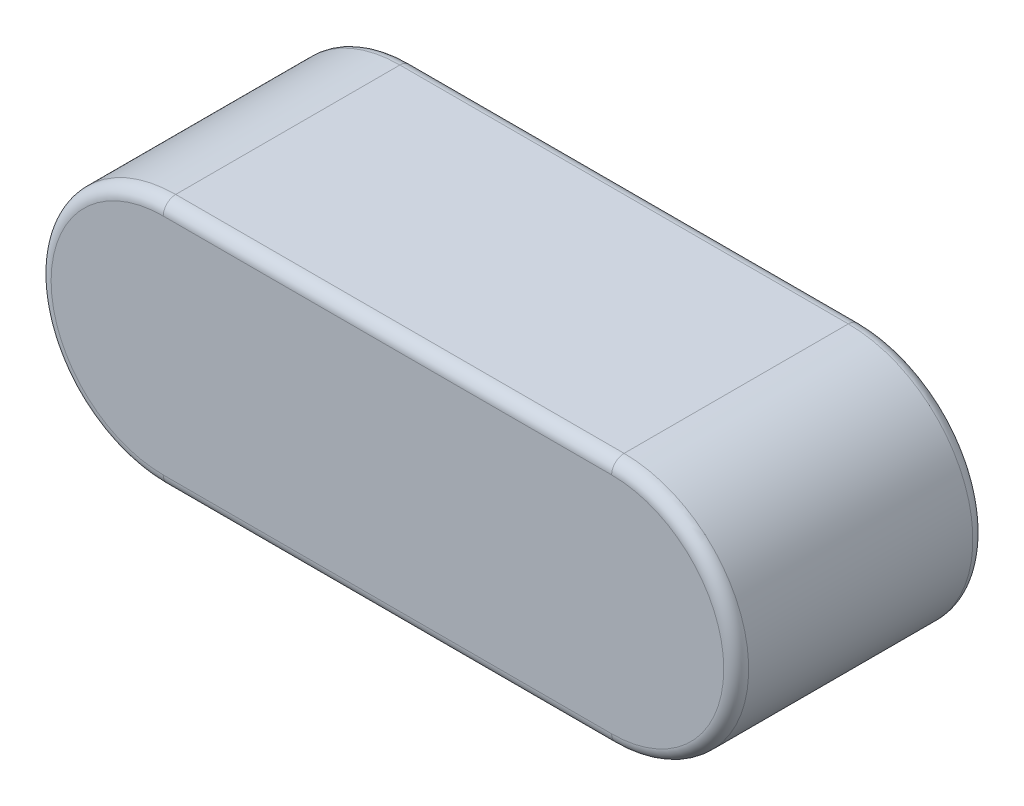
ISO-10303-21;
HEADER;
FILE_DESCRIPTION(('STEP AP214'),'2;1');
FILE_NAME('part.step','',(''),(''),'','','');
FILE_SCHEMA(('AUTOMOTIVE_DESIGN { 1 0 10303 214 1 1 1 1 }'));
ENDSEC;
DATA;
#1=APPLICATION_CONTEXT('core data for automotive mechanical design processes');
#2=APPLICATION_PROTOCOL_DEFINITION('international standard','automotive_design',2000,#1);
#3=PRODUCT_CONTEXT('',#1,'mechanical');
#4=PRODUCT('Part','Part','',(#3));
#5=PRODUCT_RELATED_PRODUCT_CATEGORY('part','',(#4));
#6=PRODUCT_DEFINITION_FORMATION('','',#4);
#7=PRODUCT_DEFINITION_CONTEXT('part definition',#1,'design');
#8=PRODUCT_DEFINITION('design','',#6,#7);
#9=PRODUCT_DEFINITION_SHAPE('','',#8);
#10=(LENGTH_UNIT() NAMED_UNIT(*) SI_UNIT(.MILLI.,.METRE.));
#11=(NAMED_UNIT(*) PLANE_ANGLE_UNIT() SI_UNIT($,.RADIAN.));
#12=(NAMED_UNIT(*) SI_UNIT($,.STERADIAN.) SOLID_ANGLE_UNIT());
#13=UNCERTAINTY_MEASURE_WITH_UNIT(LENGTH_MEASURE(1.E-05),#10,'distance_accuracy_value','');
#14=(GEOMETRIC_REPRESENTATION_CONTEXT(3) GLOBAL_UNCERTAINTY_ASSIGNED_CONTEXT((#13)) GLOBAL_UNIT_ASSIGNED_CONTEXT((#10,
#11,#12)) REPRESENTATION_CONTEXT('',''));
#15=CARTESIAN_POINT('',(0.,0.,0.));
#16=DIRECTION('',(0.,0.,1.));
#17=DIRECTION('',(1.,0.,0.));
#18=AXIS2_PLACEMENT_3D('',#15,#16,#17);
#19=CARTESIAN_POINT('',(0.,0.,5.));
#20=DIRECTION('',(0.,1.,0.));
#21=DIRECTION('',(0.,0.,1.));
#22=AXIS2_PLACEMENT_3D('',#19,#20,#21);
#23=PLANE('',#22);
#24=DIRECTION('',(0.,0.,-1.));
#25=VECTOR('',#24,1.);
#26=CARTESIAN_POINT('',(0.,0.,5.));
#27=LINE('',#26,#25);
#28=CARTESIAN_POINT('',(0.,0.,4.75));
#29=VERTEX_POINT('',#28);
#30=CARTESIAN_POINT('',(0.,0.,0.25));
#31=VERTEX_POINT('',#30);
#32=EDGE_CURVE('E148',#29,#31,#27,.T.);
#33=ORIENTED_EDGE('',*,*,#32,.T.);
#34=DIRECTION('',(1.,0.,0.));
#35=VECTOR('',#34,1.);
#36=CARTESIAN_POINT('',(0.,0.,0.25));
#37=LINE('',#36,#35);
#38=CARTESIAN_POINT('',(9.,0.,0.25));
#39=VERTEX_POINT('',#38);
#40=EDGE_CURVE('E157',#31,#39,#37,.T.);
#41=ORIENTED_EDGE('',*,*,#40,.T.);
#42=DIRECTION('',(0.,0.,-1.));
#43=VECTOR('',#42,1.);
#44=CARTESIAN_POINT('',(9.,0.,5.));
#45=LINE('',#44,#43);
#46=CARTESIAN_POINT('',(9.,0.,4.75));
#47=VERTEX_POINT('',#46);
#48=EDGE_CURVE('E126',#47,#39,#45,.T.);
#49=ORIENTED_EDGE('',*,*,#48,.F.);
#50=DIRECTION('',(1.,0.,0.));
#51=VECTOR('',#50,1.);
#52=CARTESIAN_POINT('',(0.,0.,4.75));
#53=LINE('',#52,#51);
#54=EDGE_CURVE('E159',#47,#29,#53,.F.);
#55=ORIENTED_EDGE('',*,*,#54,.T.);
#56=EDGE_LOOP('',(#33,#41,#49,#55));
#57=FACE_BOUND('',#56,.T.);
#58=ADVANCED_FACE('F39',(#57),#23,.F.);
#59=CARTESIAN_POINT('',(9.,2.5,5.));
#60=DIRECTION('',(0.,0.,-1.));
#61=DIRECTION('',(-1.,0.,0.));
#62=AXIS2_PLACEMENT_3D('',#59,#60,#61);
#63=CYLINDRICAL_SURFACE('',#62,2.5);
#64=ORIENTED_EDGE('',*,*,#48,.T.);
#65=CARTESIAN_POINT('',(9.,2.5,0.25));
#66=DIRECTION('',(0.,0.,1.));
#67=DIRECTION('',(1.,0.,0.));
#68=AXIS2_PLACEMENT_3D('',#65,#66,#67);
#69=CIRCLE('',#68,2.5);
#70=CARTESIAN_POINT('',(9.,5.,0.25));
#71=VERTEX_POINT('',#70);
#72=EDGE_CURVE('E125',#39,#71,#69,.T.);
#73=ORIENTED_EDGE('',*,*,#72,.T.);
#74=DIRECTION('',(0.,0.,-1.));
#75=VECTOR('',#74,1.);
#76=CARTESIAN_POINT('',(9.,5.,5.));
#77=LINE('',#76,#75);
#78=CARTESIAN_POINT('',(9.,5.,4.75));
#79=VERTEX_POINT('',#78);
#80=EDGE_CURVE('E108',#79,#71,#77,.T.);
#81=ORIENTED_EDGE('',*,*,#80,.F.);
#82=CARTESIAN_POINT('',(9.,2.5,4.75));
#83=DIRECTION('',(0.,0.,1.));
#84=DIRECTION('',(1.,0.,0.));
#85=AXIS2_PLACEMENT_3D('',#82,#83,#84);
#86=CIRCLE('',#85,2.5);
#87=EDGE_CURVE('E122',#79,#47,#86,.F.);
#88=ORIENTED_EDGE('',*,*,#87,.T.);
#89=EDGE_LOOP('',(#64,#73,#81,#88));
#90=FACE_BOUND('',#89,.T.);
#91=ADVANCED_FACE('F121',(#90),#63,.T.);
#92=CARTESIAN_POINT('',(0.,5.,5.));
#93=DIRECTION('',(0.,1.,0.));
#94=DIRECTION('',(0.,0.,1.));
#95=AXIS2_PLACEMENT_3D('',#92,#93,#94);
#96=PLANE('',#95);
#97=ORIENTED_EDGE('',*,*,#80,.T.);
#98=DIRECTION('',(1.,0.,0.));
#99=VECTOR('',#98,1.);
#100=CARTESIAN_POINT('',(0.,5.,0.25));
#101=LINE('',#100,#99);
#102=CARTESIAN_POINT('',(0.,5.,0.25));
#103=VERTEX_POINT('',#102);
#104=EDGE_CURVE('E114',#71,#103,#101,.F.);
#105=ORIENTED_EDGE('',*,*,#104,.T.);
#106=DIRECTION('',(0.,0.,-1.));
#107=VECTOR('',#106,1.);
#108=CARTESIAN_POINT('',(0.,5.,5.));
#109=LINE('',#108,#107);
#110=CARTESIAN_POINT('',(0.,5.,4.75));
#111=VERTEX_POINT('',#110);
#112=EDGE_CURVE('E110',#111,#103,#109,.T.);
#113=ORIENTED_EDGE('',*,*,#112,.F.);
#114=DIRECTION('',(1.,0.,0.));
#115=VECTOR('',#114,1.);
#116=CARTESIAN_POINT('',(0.,5.,4.75));
#117=LINE('',#116,#115);
#118=EDGE_CURVE('E105',#111,#79,#117,.T.);
#119=ORIENTED_EDGE('',*,*,#118,.T.);
#120=EDGE_LOOP('',(#97,#105,#113,#119));
#121=FACE_BOUND('',#120,.T.);
#122=ADVANCED_FACE('F107',(#121),#96,.T.);
#123=CARTESIAN_POINT('',(0.,2.5,5.));
#124=DIRECTION('',(0.,0.,-1.));
#125=DIRECTION('',(-1.,0.,0.));
#126=AXIS2_PLACEMENT_3D('',#123,#124,#125);
#127=CYLINDRICAL_SURFACE('',#126,2.5);
#128=ORIENTED_EDGE('',*,*,#112,.T.);
#129=CARTESIAN_POINT('',(0.,2.5,0.25));
#130=DIRECTION('',(0.,0.,1.));
#131=DIRECTION('',(1.,0.,0.));
#132=AXIS2_PLACEMENT_3D('',#129,#130,#131);
#133=CIRCLE('',#132,2.5);
#134=EDGE_CURVE('E161',#103,#31,#133,.T.);
#135=ORIENTED_EDGE('',*,*,#134,.T.);
#136=ORIENTED_EDGE('',*,*,#32,.F.);
#137=CARTESIAN_POINT('',(0.,2.5,4.75));
#138=DIRECTION('',(0.,0.,1.));
#139=DIRECTION('',(1.,0.,0.));
#140=AXIS2_PLACEMENT_3D('',#137,#138,#139);
#141=CIRCLE('',#140,2.5);
#142=EDGE_CURVE('E163',#29,#111,#141,.F.);
#143=ORIENTED_EDGE('',*,*,#142,.T.);
#144=EDGE_LOOP('',(#128,#135,#136,#143));
#145=FACE_BOUND('',#144,.T.);
#146=ADVANCED_FACE('F201',(#145),#127,.T.);
#147=CARTESIAN_POINT('',(0.,0.,5.));
#148=DIRECTION('',(0.,0.,1.));
#149=DIRECTION('',(1.,0.,0.));
#150=AXIS2_PLACEMENT_3D('',#147,#148,#149);
#151=PLANE('',#150);
#152=DIRECTION('',(1.,0.,0.));
#153=VECTOR('',#152,1.);
#154=CARTESIAN_POINT('',(0.,4.75,5.));
#155=LINE('',#154,#153);
#156=CARTESIAN_POINT('',(9.,4.75,5.));
#157=VERTEX_POINT('',#156);
#158=CARTESIAN_POINT('',(0.,4.75,5.));
#159=VERTEX_POINT('',#158);
#160=EDGE_CURVE('E48',#157,#159,#155,.F.);
#161=ORIENTED_EDGE('',*,*,#160,.T.);
#162=CARTESIAN_POINT('',(0.,2.5,5.));
#163=DIRECTION('',(0.,0.,1.));
#164=DIRECTION('',(1.,0.,0.));
#165=AXIS2_PLACEMENT_3D('',#162,#163,#164);
#166=CIRCLE('',#165,2.25);
#167=CARTESIAN_POINT('',(0.,0.25,5.));
#168=VERTEX_POINT('',#167);
#169=EDGE_CURVE('E11',#159,#168,#166,.T.);
#170=ORIENTED_EDGE('',*,*,#169,.T.);
#171=DIRECTION('',(1.,0.,0.));
#172=VECTOR('',#171,1.);
#173=CARTESIAN_POINT('',(9.,0.25,5.));
#174=LINE('',#173,#172);
#175=CARTESIAN_POINT('',(9.,0.25,5.));
#176=VERTEX_POINT('',#175);
#177=EDGE_CURVE('E155',#168,#176,#174,.T.);
#178=ORIENTED_EDGE('',*,*,#177,.T.);
#179=CARTESIAN_POINT('',(9.,2.5,5.));
#180=DIRECTION('',(0.,0.,1.));
#181=DIRECTION('',(1.,0.,0.));
#182=AXIS2_PLACEMENT_3D('',#179,#180,#181);
#183=CIRCLE('',#182,2.25);
#184=EDGE_CURVE('E59',#176,#157,#183,.T.);
#185=ORIENTED_EDGE('',*,*,#184,.T.);
#186=EDGE_LOOP('',(#161,#170,#178,#185));
#187=FACE_BOUND('',#186,.T.);
#188=ADVANCED_FACE('F207',(#187),#151,.T.);
#189=CARTESIAN_POINT('',(0.,0.,0.));
#190=DIRECTION('',(0.,0.,1.));
#191=DIRECTION('',(1.,0.,0.));
#192=AXIS2_PLACEMENT_3D('',#189,#190,#191);
#193=PLANE('',#192);
#194=DIRECTION('',(1.,0.,0.));
#195=VECTOR('',#194,1.);
#196=CARTESIAN_POINT('',(9.,4.75,0.));
#197=LINE('',#196,#195);
#198=CARTESIAN_POINT('',(0.,4.75,0.));
#199=VERTEX_POINT('',#198);
#200=CARTESIAN_POINT('',(9.,4.75,0.));
#201=VERTEX_POINT('',#200);
#202=EDGE_CURVE('E168',#199,#201,#197,.T.);
#203=ORIENTED_EDGE('',*,*,#202,.T.);
#204=CARTESIAN_POINT('',(9.,2.5,0.));
#205=DIRECTION('',(0.,0.,1.));
#206=DIRECTION('',(1.,0.,0.));
#207=AXIS2_PLACEMENT_3D('',#204,#205,#206);
#208=CIRCLE('',#207,2.25);
#209=CARTESIAN_POINT('',(9.,0.25,0.));
#210=VERTEX_POINT('',#209);
#211=EDGE_CURVE('E115',#201,#210,#208,.F.);
#212=ORIENTED_EDGE('',*,*,#211,.T.);
#213=DIRECTION('',(1.,0.,0.));
#214=VECTOR('',#213,1.);
#215=CARTESIAN_POINT('',(0.,0.25,0.));
#216=LINE('',#215,#214);
#217=CARTESIAN_POINT('',(0.,0.25,0.));
#218=VERTEX_POINT('',#217);
#219=EDGE_CURVE('E172',#210,#218,#216,.F.);
#220=ORIENTED_EDGE('',*,*,#219,.T.);
#221=CARTESIAN_POINT('',(0.,2.5,0.));
#222=DIRECTION('',(0.,0.,1.));
#223=DIRECTION('',(1.,0.,0.));
#224=AXIS2_PLACEMENT_3D('',#221,#222,#223);
#225=CIRCLE('',#224,2.25);
#226=EDGE_CURVE('E170',#218,#199,#225,.F.);
#227=ORIENTED_EDGE('',*,*,#226,.T.);
#228=EDGE_LOOP('',(#203,#212,#220,#227));
#229=FACE_BOUND('',#228,.T.);
#230=ADVANCED_FACE('F209',(#229),#193,.F.);
#231=CARTESIAN_POINT('',(0.,2.5,0.25));
#232=DIRECTION('',(0.,0.,1.));
#233=DIRECTION('',(1.,0.,0.));
#234=AXIS2_PLACEMENT_3D('',#231,#232,#233);
#235=TOROIDAL_SURFACE('',#234,2.25,0.25);
#236=CARTESIAN_POINT('',(0.,4.75,0.25));
#237=DIRECTION('',(1.,0.,0.));
#238=DIRECTION('',(0.,0.,-1.));
#239=AXIS2_PLACEMENT_3D('',#236,#237,#238);
#240=CIRCLE('',#239,0.25);
#241=EDGE_CURVE('E149',#199,#103,#240,.T.);
#242=ORIENTED_EDGE('',*,*,#241,.F.);
#243=ORIENTED_EDGE('',*,*,#226,.F.);
#244=CARTESIAN_POINT('',(0.,0.25,0.25));
#245=DIRECTION('',(1.,0.,0.));
#246=DIRECTION('',(0.,1.,0.));
#247=AXIS2_PLACEMENT_3D('',#244,#245,#246);
#248=CIRCLE('',#247,0.25);
#249=EDGE_CURVE('E145',#31,#218,#248,.T.);
#250=ORIENTED_EDGE('',*,*,#249,.F.);
#251=ORIENTED_EDGE('',*,*,#134,.F.);
#252=EDGE_LOOP('',(#242,#243,#250,#251));
#253=FACE_BOUND('',#252,.T.);
#254=ADVANCED_FACE('F188',(#253),#235,.T.);
#255=CARTESIAN_POINT('',(0.,0.25,0.25));
#256=DIRECTION('',(1.,0.,0.));
#257=DIRECTION('',(0.,0.,-1.));
#258=AXIS2_PLACEMENT_3D('',#255,#256,#257);
#259=CYLINDRICAL_SURFACE('',#258,0.25);
#260=ORIENTED_EDGE('',*,*,#249,.T.);
#261=ORIENTED_EDGE('',*,*,#219,.F.);
#262=CARTESIAN_POINT('',(9.,0.25,0.25));
#263=DIRECTION('',(1.,0.,0.));
#264=DIRECTION('',(0.,0.,-1.));
#265=AXIS2_PLACEMENT_3D('',#262,#263,#264);
#266=CIRCLE('',#265,0.25);
#267=EDGE_CURVE('E136',#39,#210,#266,.T.);
#268=ORIENTED_EDGE('',*,*,#267,.F.);
#269=ORIENTED_EDGE('',*,*,#40,.F.);
#270=EDGE_LOOP('',(#260,#261,#268,#269));
#271=FACE_BOUND('',#270,.T.);
#272=ADVANCED_FACE('F192',(#271),#259,.T.);
#273=CARTESIAN_POINT('',(0.,4.75,0.25));
#274=DIRECTION('',(-1.,0.,0.));
#275=DIRECTION('',(0.,0.,1.));
#276=AXIS2_PLACEMENT_3D('',#273,#274,#275);
#277=CYLINDRICAL_SURFACE('',#276,0.25);
#278=ORIENTED_EDGE('',*,*,#241,.T.);
#279=ORIENTED_EDGE('',*,*,#104,.F.);
#280=CARTESIAN_POINT('',(9.,4.75,0.25));
#281=DIRECTION('',(1.,0.,0.));
#282=DIRECTION('',(0.,0.,-1.));
#283=AXIS2_PLACEMENT_3D('',#280,#281,#282);
#284=CIRCLE('',#283,0.25);
#285=EDGE_CURVE('E135',#201,#71,#284,.T.);
#286=ORIENTED_EDGE('',*,*,#285,.F.);
#287=ORIENTED_EDGE('',*,*,#202,.F.);
#288=EDGE_LOOP('',(#278,#279,#286,#287));
#289=FACE_BOUND('',#288,.T.);
#290=ADVANCED_FACE('F200',(#289),#277,.T.);
#291=CARTESIAN_POINT('',(9.,2.5,0.25));
#292=DIRECTION('',(0.,0.,1.));
#293=DIRECTION('',(1.,0.,0.));
#294=AXIS2_PLACEMENT_3D('',#291,#292,#293);
#295=TOROIDAL_SURFACE('',#294,2.25,0.25);
#296=ORIENTED_EDGE('',*,*,#267,.T.);
#297=ORIENTED_EDGE('',*,*,#211,.F.);
#298=ORIENTED_EDGE('',*,*,#285,.T.);
#299=ORIENTED_EDGE('',*,*,#72,.F.);
#300=EDGE_LOOP('',(#296,#297,#298,#299));
#301=FACE_BOUND('',#300,.T.);
#302=ADVANCED_FACE('F195',(#301),#295,.T.);
#303=CARTESIAN_POINT('',(9.,2.5,4.75));
#304=DIRECTION('',(0.,0.,1.));
#305=DIRECTION('',(1.,0.,0.));
#306=AXIS2_PLACEMENT_3D('',#303,#304,#305);
#307=TOROIDAL_SURFACE('',#306,2.25,0.25);
#308=CARTESIAN_POINT('',(9.,0.25,4.75));
#309=DIRECTION('',(-1.,0.,0.));
#310=DIRECTION('',(0.,0.,1.));
#311=AXIS2_PLACEMENT_3D('',#308,#309,#310);
#312=CIRCLE('',#311,0.25);
#313=EDGE_CURVE('E131',#47,#176,#312,.T.);
#314=ORIENTED_EDGE('',*,*,#313,.F.);
#315=ORIENTED_EDGE('',*,*,#87,.F.);
#316=CARTESIAN_POINT('',(9.,4.75,4.75));
#317=DIRECTION('',(-1.,0.,0.));
#318=DIRECTION('',(0.,0.,1.));
#319=AXIS2_PLACEMENT_3D('',#316,#317,#318);
#320=CIRCLE('',#319,0.25);
#321=EDGE_CURVE('E43',#157,#79,#320,.T.);
#322=ORIENTED_EDGE('',*,*,#321,.F.);
#323=ORIENTED_EDGE('',*,*,#184,.F.);
#324=EDGE_LOOP('',(#314,#315,#322,#323));
#325=FACE_BOUND('',#324,.T.);
#326=ADVANCED_FACE('F41',(#325),#307,.T.);
#327=CARTESIAN_POINT('',(0.,4.75,4.75));
#328=DIRECTION('',(1.,0.,0.));
#329=DIRECTION('',(0.,0.,-1.));
#330=AXIS2_PLACEMENT_3D('',#327,#328,#329);
#331=CYLINDRICAL_SURFACE('',#330,0.25);
#332=ORIENTED_EDGE('',*,*,#321,.T.);
#333=ORIENTED_EDGE('',*,*,#118,.F.);
#334=CARTESIAN_POINT('',(0.,4.75,4.75));
#335=DIRECTION('',(-1.,0.,0.));
#336=DIRECTION('',(0.,-1.,0.));
#337=AXIS2_PLACEMENT_3D('',#334,#335,#336);
#338=CIRCLE('',#337,0.25);
#339=EDGE_CURVE('E138',#159,#111,#338,.T.);
#340=ORIENTED_EDGE('',*,*,#339,.F.);
#341=ORIENTED_EDGE('',*,*,#160,.F.);
#342=EDGE_LOOP('',(#332,#333,#340,#341));
#343=FACE_BOUND('',#342,.T.);
#344=ADVANCED_FACE('F134',(#343),#331,.T.);
#345=CARTESIAN_POINT('',(0.,0.25,4.75));
#346=DIRECTION('',(-1.,0.,0.));
#347=DIRECTION('',(0.,0.,1.));
#348=AXIS2_PLACEMENT_3D('',#345,#346,#347);
#349=CYLINDRICAL_SURFACE('',#348,0.25);
#350=ORIENTED_EDGE('',*,*,#313,.T.);
#351=ORIENTED_EDGE('',*,*,#177,.F.);
#352=CARTESIAN_POINT('',(0.,0.25,4.75));
#353=DIRECTION('',(-1.,0.,0.));
#354=DIRECTION('',(0.,0.,1.));
#355=AXIS2_PLACEMENT_3D('',#352,#353,#354);
#356=CIRCLE('',#355,0.25);
#357=EDGE_CURVE('E141',#29,#168,#356,.T.);
#358=ORIENTED_EDGE('',*,*,#357,.F.);
#359=ORIENTED_EDGE('',*,*,#54,.F.);
#360=EDGE_LOOP('',(#350,#351,#358,#359));
#361=FACE_BOUND('',#360,.T.);
#362=ADVANCED_FACE('F206',(#361),#349,.T.);
#363=CARTESIAN_POINT('',(0.,2.5,4.75));
#364=DIRECTION('',(0.,0.,1.));
#365=DIRECTION('',(1.,0.,0.));
#366=AXIS2_PLACEMENT_3D('',#363,#364,#365);
#367=TOROIDAL_SURFACE('',#366,2.25,0.25);
#368=ORIENTED_EDGE('',*,*,#339,.T.);
#369=ORIENTED_EDGE('',*,*,#142,.F.);
#370=ORIENTED_EDGE('',*,*,#357,.T.);
#371=ORIENTED_EDGE('',*,*,#169,.F.);
#372=EDGE_LOOP('',(#368,#369,#370,#371));
#373=FACE_BOUND('',#372,.T.);
#374=ADVANCED_FACE('F204',(#373),#367,.T.);
#375=CLOSED_SHELL('',(#58,#91,#122,#146,#188,#230,#254,#272,#290,#302,#326,#344,#362,#374));
#376=MANIFOLD_SOLID_BREP('B2',#375);
#377=ADVANCED_BREP_SHAPE_REPRESENTATION('',(#18,#376),#14);
#378=SHAPE_DEFINITION_REPRESENTATION(#9,#377);
ENDSEC;
END-ISO-10303-21;
